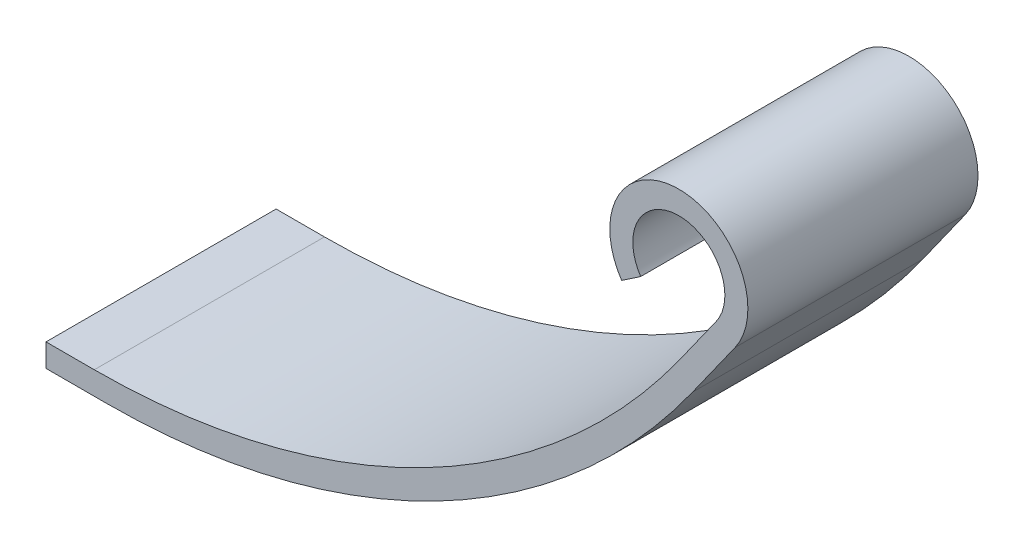
ISO-10303-21;
HEADER;
FILE_DESCRIPTION(('STEP AP214'),'2;1');
FILE_NAME('part.step','',(''),(''),'','','');
FILE_SCHEMA(('AUTOMOTIVE_DESIGN { 1 0 10303 214 1 1 1 1 }'));
ENDSEC;
DATA;
#1=APPLICATION_CONTEXT('core data for automotive mechanical design processes');
#2=APPLICATION_PROTOCOL_DEFINITION('international standard','automotive_design',2000,#1);
#3=PRODUCT_CONTEXT('',#1,'mechanical');
#4=PRODUCT('Part','Part','',(#3));
#5=PRODUCT_RELATED_PRODUCT_CATEGORY('part','',(#4));
#6=PRODUCT_DEFINITION_FORMATION('','',#4);
#7=PRODUCT_DEFINITION_CONTEXT('part definition',#1,'design');
#8=PRODUCT_DEFINITION('design','',#6,#7);
#9=PRODUCT_DEFINITION_SHAPE('','',#8);
#10=(LENGTH_UNIT() NAMED_UNIT(*) SI_UNIT(.MILLI.,.METRE.));
#11=(NAMED_UNIT(*) PLANE_ANGLE_UNIT() SI_UNIT($,.RADIAN.));
#12=(NAMED_UNIT(*) SI_UNIT($,.STERADIAN.) SOLID_ANGLE_UNIT());
#13=UNCERTAINTY_MEASURE_WITH_UNIT(LENGTH_MEASURE(1.E-05),#10,'distance_accuracy_value','');
#14=(GEOMETRIC_REPRESENTATION_CONTEXT(3) GLOBAL_UNCERTAINTY_ASSIGNED_CONTEXT((#13)) GLOBAL_UNIT_ASSIGNED_CONTEXT((#10,
#11,#12)) REPRESENTATION_CONTEXT('',''));
#15=CARTESIAN_POINT('',(0.,0.,0.));
#16=DIRECTION('',(0.,0.,1.));
#17=DIRECTION('',(1.,0.,0.));
#18=AXIS2_PLACEMENT_3D('',#15,#16,#17);
#19=CARTESIAN_POINT('',(0.,0.,8.));
#20=DIRECTION('',(1.,0.,0.));
#21=DIRECTION('',(0.,0.,-1.));
#22=AXIS2_PLACEMENT_3D('',#19,#20,#21);
#23=PLANE('',#22);
#24=DIRECTION('',(0.,-1.,0.));
#25=VECTOR('',#24,1.);
#26=CARTESIAN_POINT('',(0.,0.,0.));
#27=LINE('',#26,#25);
#28=CARTESIAN_POINT('',(0.,0.8,0.));
#29=VERTEX_POINT('',#28);
#30=CARTESIAN_POINT('',(0.,0.,0.));
#31=VERTEX_POINT('',#30);
#32=EDGE_CURVE('E135',#29,#31,#27,.T.);
#33=ORIENTED_EDGE('',*,*,#32,.T.);
#34=DIRECTION('',(0.,0.,-1.));
#35=VECTOR('',#34,1.);
#36=CARTESIAN_POINT('',(0.,0.,8.));
#37=LINE('',#36,#35);
#38=CARTESIAN_POINT('',(0.,0.,8.));
#39=VERTEX_POINT('',#38);
#40=EDGE_CURVE('E116',#39,#31,#37,.T.);
#41=ORIENTED_EDGE('',*,*,#40,.F.);
#42=DIRECTION('',(0.,-1.,0.));
#43=VECTOR('',#42,1.);
#44=CARTESIAN_POINT('',(0.,0.,8.));
#45=LINE('',#44,#43);
#46=CARTESIAN_POINT('',(0.,0.8,8.));
#47=VERTEX_POINT('',#46);
#48=EDGE_CURVE('E123',#47,#39,#45,.T.);
#49=ORIENTED_EDGE('',*,*,#48,.F.);
#50=DIRECTION('',(0.,0.,-1.));
#51=VECTOR('',#50,1.);
#52=CARTESIAN_POINT('',(0.,0.8,8.));
#53=LINE('',#52,#51);
#54=EDGE_CURVE('E178',#47,#29,#53,.T.);
#55=ORIENTED_EDGE('',*,*,#54,.T.);
#56=EDGE_LOOP('',(#33,#41,#49,#55));
#57=FACE_BOUND('',#56,.T.);
#58=ADVANCED_FACE('F33',(#57),#23,.F.);
#59=CARTESIAN_POINT('',(0.,0.,8.));
#60=DIRECTION('',(0.,1.,0.));
#61=DIRECTION('',(0.,0.,1.));
#62=AXIS2_PLACEMENT_3D('',#59,#60,#61);
#63=PLANE('',#62);
#64=DIRECTION('',(1.,0.,0.));
#65=VECTOR('',#64,1.);
#66=CARTESIAN_POINT('',(0.,0.,0.));
#67=LINE('',#66,#65);
#68=CARTESIAN_POINT('',(2.09240085245693,0.,0.));
#69=VERTEX_POINT('',#68);
#70=EDGE_CURVE('E155',#31,#69,#67,.T.);
#71=ORIENTED_EDGE('',*,*,#70,.T.);
#72=DIRECTION('',(0.,0.,-1.));
#73=VECTOR('',#72,1.);
#74=CARTESIAN_POINT('',(2.09240085245693,0.,8.));
#75=LINE('',#74,#73);
#76=CARTESIAN_POINT('',(2.09240085245693,0.,8.));
#77=VERTEX_POINT('',#76);
#78=EDGE_CURVE('E119',#69,#77,#75,.F.);
#79=ORIENTED_EDGE('',*,*,#78,.T.);
#80=DIRECTION('',(1.,0.,0.));
#81=VECTOR('',#80,1.);
#82=CARTESIAN_POINT('',(0.,0.,8.));
#83=LINE('',#82,#81);
#84=EDGE_CURVE('E111',#39,#77,#83,.T.);
#85=ORIENTED_EDGE('',*,*,#84,.F.);
#86=ORIENTED_EDGE('',*,*,#40,.T.);
#87=EDGE_LOOP('',(#71,#79,#85,#86));
#88=FACE_BOUND('',#87,.T.);
#89=ADVANCED_FACE('F114',(#88),#63,.F.);
#90=CARTESIAN_POINT('',(15.,0.,8.));
#91=DIRECTION('',(-0.8152791451879,0.579068144022521,0.));
#92=DIRECTION('',(-0.579068144022521,-0.8152791451879,0.));
#93=AXIS2_PLACEMENT_3D('',#90,#91,#92);
#94=PLANE('',#93);
#95=DIRECTION('',(0.579068144022521,0.8152791451879,0.));
#96=VECTOR('',#95,1.);
#97=CARTESIAN_POINT('',(15.,0.,8.));
#98=LINE('',#97,#96);
#99=CARTESIAN_POINT('',(22.4743794821544,10.523296399437,8.));
#100=VERTEX_POINT('',#99);
#101=CARTESIAN_POINT('',(23.956669948451,12.610236454346,8.));
#102=VERTEX_POINT('',#101);
#103=EDGE_CURVE('E122',#100,#102,#98,.T.);
#104=ORIENTED_EDGE('',*,*,#103,.F.);
#105=DIRECTION('',(0.,0.,-1.));
#106=VECTOR('',#105,1.);
#107=CARTESIAN_POINT('',(22.4743794821544,10.523296399437,8.));
#108=LINE('',#107,#106);
#109=CARTESIAN_POINT('',(22.4743794821544,10.523296399437,0.));
#110=VERTEX_POINT('',#109);
#111=EDGE_CURVE('E136',#100,#110,#108,.T.);
#112=ORIENTED_EDGE('',*,*,#111,.T.);
#113=DIRECTION('',(0.579068144022521,0.8152791451879,0.));
#114=VECTOR('',#113,1.);
#115=CARTESIAN_POINT('',(15.,0.,0.));
#116=LINE('',#115,#114);
#117=CARTESIAN_POINT('',(23.956669948451,12.610236454346,0.));
#118=VERTEX_POINT('',#117);
#119=EDGE_CURVE('E157',#110,#118,#116,.T.);
#120=ORIENTED_EDGE('',*,*,#119,.T.);
#121=DIRECTION('',(0.,0.,-1.));
#122=VECTOR('',#121,1.);
#123=CARTESIAN_POINT('',(23.956669948451,12.610236454346,8.));
#124=LINE('',#123,#122);
#125=EDGE_CURVE('E137',#102,#118,#124,.T.);
#126=ORIENTED_EDGE('',*,*,#125,.F.);
#127=EDGE_LOOP('',(#104,#112,#120,#126));
#128=FACE_BOUND('',#127,.T.);
#129=ADVANCED_FACE('F165',(#128),#94,.F.);
#130=CARTESIAN_POINT('',(22.,14.,8.));
#131=DIRECTION('',(0.,0.,-1.));
#132=DIRECTION('',(-1.,0.,0.));
#133=AXIS2_PLACEMENT_3D('',#130,#131,#132);
#134=CYLINDRICAL_SURFACE('',#133,2.4);
#135=CARTESIAN_POINT('',(22.,14.,0.));
#136=DIRECTION('',(0.,0.,1.));
#137=DIRECTION('',(1.,0.,0.));
#138=AXIS2_PLACEMENT_3D('',#135,#136,#137);
#139=CIRCLE('',#138,2.4);
#140=CARTESIAN_POINT('',(20.0118829343515,12.6556077457538,0.));
#141=VERTEX_POINT('',#140);
#142=EDGE_CURVE('E181',#118,#141,#139,.T.);
#143=ORIENTED_EDGE('',*,*,#142,.T.);
#144=DIRECTION('',(0.,0.,-1.));
#145=VECTOR('',#144,1.);
#146=CARTESIAN_POINT('',(20.0118829343515,12.6556077457538,8.));
#147=LINE('',#146,#145);
#148=CARTESIAN_POINT('',(20.0118829343515,12.6556077457538,8.));
#149=VERTEX_POINT('',#148);
#150=EDGE_CURVE('E142',#149,#141,#147,.T.);
#151=ORIENTED_EDGE('',*,*,#150,.F.);
#152=CARTESIAN_POINT('',(22.,14.,8.));
#153=DIRECTION('',(0.,0.,1.));
#154=DIRECTION('',(1.,0.,0.));
#155=AXIS2_PLACEMENT_3D('',#152,#153,#154);
#156=CIRCLE('',#155,2.4);
#157=EDGE_CURVE('E167',#102,#149,#156,.T.);
#158=ORIENTED_EDGE('',*,*,#157,.F.);
#159=ORIENTED_EDGE('',*,*,#125,.T.);
#160=EDGE_LOOP('',(#143,#151,#158,#159));
#161=FACE_BOUND('',#160,.T.);
#162=ADVANCED_FACE('F263',(#161),#134,.T.);
#163=CARTESIAN_POINT('',(20.674588622901,13.1037384971692,8.));
#164=DIRECTION('',(-0.560163439269271,0.828382110686863,0.));
#165=DIRECTION('',(-0.828382110686863,-0.560163439269271,0.));
#166=AXIS2_PLACEMENT_3D('',#163,#164,#165);
#167=PLANE('',#166);
#168=DIRECTION('',(0.828382110686863,0.560163439269271,0.));
#169=VECTOR('',#168,1.);
#170=CARTESIAN_POINT('',(20.674588622901,13.1037384971692,0.));
#171=LINE('',#170,#169);
#172=CARTESIAN_POINT('',(20.674588622901,13.1037384971692,0.));
#173=VERTEX_POINT('',#172);
#174=EDGE_CURVE('E183',#141,#173,#171,.T.);
#175=ORIENTED_EDGE('',*,*,#174,.T.);
#176=DIRECTION('',(0.,0.,-1.));
#177=VECTOR('',#176,1.);
#178=CARTESIAN_POINT('',(20.674588622901,13.1037384971692,8.));
#179=LINE('',#178,#177);
#180=CARTESIAN_POINT('',(20.674588622901,13.1037384971692,8.));
#181=VERTEX_POINT('',#180);
#182=EDGE_CURVE('E194',#181,#173,#179,.T.);
#183=ORIENTED_EDGE('',*,*,#182,.F.);
#184=DIRECTION('',(0.828382110686863,0.560163439269271,0.));
#185=VECTOR('',#184,1.);
#186=CARTESIAN_POINT('',(20.674588622901,13.1037384971692,8.));
#187=LINE('',#186,#185);
#188=EDGE_CURVE('E169',#149,#181,#187,.T.);
#189=ORIENTED_EDGE('',*,*,#188,.F.);
#190=ORIENTED_EDGE('',*,*,#150,.T.);
#191=EDGE_LOOP('',(#175,#183,#189,#190));
#192=FACE_BOUND('',#191,.T.);
#193=ADVANCED_FACE('F201',(#192),#167,.F.);
#194=CARTESIAN_POINT('',(22.,14.,8.));
#195=DIRECTION('',(0.,0.,-1.));
#196=DIRECTION('',(-1.,0.,0.));
#197=AXIS2_PLACEMENT_3D('',#194,#195,#196);
#198=CYLINDRICAL_SURFACE('',#197,1.6);
#199=CARTESIAN_POINT('',(22.,14.,0.));
#200=DIRECTION('',(0.,0.,-1.));
#201=DIRECTION('',(1.,0.,0.));
#202=AXIS2_PLACEMENT_3D('',#199,#200,#201);
#203=CIRCLE('',#202,1.6);
#204=CARTESIAN_POINT('',(23.3044466323006,13.073490969564,0.));
#205=VERTEX_POINT('',#204);
#206=EDGE_CURVE('E185',#173,#205,#203,.T.);
#207=ORIENTED_EDGE('',*,*,#206,.T.);
#208=DIRECTION('',(0.,0.,-1.));
#209=VECTOR('',#208,1.);
#210=CARTESIAN_POINT('',(23.3044466323006,13.073490969564,8.));
#211=LINE('',#210,#209);
#212=CARTESIAN_POINT('',(23.3044466323006,13.073490969564,8.));
#213=VERTEX_POINT('',#212);
#214=EDGE_CURVE('E191',#213,#205,#211,.T.);
#215=ORIENTED_EDGE('',*,*,#214,.F.);
#216=CARTESIAN_POINT('',(22.,14.,8.));
#217=DIRECTION('',(0.,0.,-1.));
#218=DIRECTION('',(1.,0.,0.));
#219=AXIS2_PLACEMENT_3D('',#216,#217,#218);
#220=CIRCLE('',#219,1.6);
#221=EDGE_CURVE('E173',#181,#213,#220,.T.);
#222=ORIENTED_EDGE('',*,*,#221,.F.);
#223=ORIENTED_EDGE('',*,*,#182,.T.);
#224=EDGE_LOOP('',(#207,#215,#222,#223));
#225=FACE_BOUND('',#224,.T.);
#226=ADVANCED_FACE('F207',(#225),#198,.F.);
#227=CARTESIAN_POINT('',(14.5869568272786,0.8,8.));
#228=DIRECTION('',(0.8152791451879,-0.579068144022521,0.));
#229=DIRECTION('',(0.579068144022521,0.8152791451879,0.));
#230=AXIS2_PLACEMENT_3D('',#227,#228,#229);
#231=PLANE('',#230);
#232=DIRECTION('',(-0.579068144022521,-0.8152791451879,0.));
#233=VECTOR('',#232,1.);
#234=CARTESIAN_POINT('',(14.5869568272786,0.8,0.));
#235=LINE('',#234,#233);
#236=CARTESIAN_POINT('',(22.0613363094331,11.323296399437,0.));
#237=VERTEX_POINT('',#236);
#238=EDGE_CURVE('E187',#205,#237,#235,.T.);
#239=ORIENTED_EDGE('',*,*,#238,.T.);
#240=DIRECTION('',(0.,0.,-1.));
#241=VECTOR('',#240,1.);
#242=CARTESIAN_POINT('',(22.0613363094331,11.323296399437,8.));
#243=LINE('',#242,#241);
#244=CARTESIAN_POINT('',(22.0613363094331,11.323296399437,8.));
#245=VERTEX_POINT('',#244);
#246=EDGE_CURVE('E48',#237,#245,#243,.F.);
#247=ORIENTED_EDGE('',*,*,#246,.T.);
#248=DIRECTION('',(-0.579068144022521,-0.8152791451879,0.));
#249=VECTOR('',#248,1.);
#250=CARTESIAN_POINT('',(14.5869568272786,0.8,8.));
#251=LINE('',#250,#249);
#252=EDGE_CURVE('E175',#213,#245,#251,.T.);
#253=ORIENTED_EDGE('',*,*,#252,.F.);
#254=ORIENTED_EDGE('',*,*,#214,.T.);
#255=EDGE_LOOP('',(#239,#247,#253,#254));
#256=FACE_BOUND('',#255,.T.);
#257=ADVANCED_FACE('F209',(#256),#231,.F.);
#258=CARTESIAN_POINT('',(0.,0.8,8.));
#259=DIRECTION('',(0.,-1.,0.));
#260=DIRECTION('',(1.,0.,0.));
#261=AXIS2_PLACEMENT_3D('',#258,#259,#260);
#262=PLANE('',#261);
#263=DIRECTION('',(-1.,0.,0.));
#264=VECTOR('',#263,1.);
#265=CARTESIAN_POINT('',(0.,0.8,8.));
#266=LINE('',#265,#264);
#267=CARTESIAN_POINT('',(1.67935767973556,0.8,8.));
#268=VERTEX_POINT('',#267);
#269=EDGE_CURVE('E128',#268,#47,#266,.T.);
#270=ORIENTED_EDGE('',*,*,#269,.F.);
#271=DIRECTION('',(0.,0.,-1.));
#272=VECTOR('',#271,1.);
#273=CARTESIAN_POINT('',(1.67935767973556,0.8,0.));
#274=LINE('',#273,#272);
#275=CARTESIAN_POINT('',(1.67935767973556,0.8,0.));
#276=VERTEX_POINT('',#275);
#277=EDGE_CURVE('E147',#268,#276,#274,.T.);
#278=ORIENTED_EDGE('',*,*,#277,.T.);
#279=DIRECTION('',(-1.,0.,0.));
#280=VECTOR('',#279,1.);
#281=CARTESIAN_POINT('',(0.,0.8,0.));
#282=LINE('',#281,#280);
#283=EDGE_CURVE('E132',#276,#29,#282,.T.);
#284=ORIENTED_EDGE('',*,*,#283,.T.);
#285=ORIENTED_EDGE('',*,*,#54,.F.);
#286=EDGE_LOOP('',(#270,#278,#284,#285));
#287=FACE_BOUND('',#286,.T.);
#288=ADVANCED_FACE('F214',(#287),#262,.F.);
#289=CARTESIAN_POINT('',(22.,14.,8.));
#290=DIRECTION('',(0.,0.,1.));
#291=DIRECTION('',(1.,0.,0.));
#292=AXIS2_PLACEMENT_3D('',#289,#290,#291);
#293=PLANE('',#292);
#294=ORIENTED_EDGE('',*,*,#84,.T.);
#295=CARTESIAN_POINT('',(2.09240085245693,25.,8.));
#296=DIRECTION('',(0.,0.,1.));
#297=DIRECTION('',(1.,0.,0.));
#298=AXIS2_PLACEMENT_3D('',#295,#296,#297);
#299=CIRCLE('',#298,25.);
#300=EDGE_CURVE('E11',#77,#100,#299,.T.);
#301=ORIENTED_EDGE('',*,*,#300,.T.);
#302=ORIENTED_EDGE('',*,*,#103,.T.);
#303=ORIENTED_EDGE('',*,*,#157,.T.);
#304=ORIENTED_EDGE('',*,*,#188,.T.);
#305=ORIENTED_EDGE('',*,*,#221,.T.);
#306=ORIENTED_EDGE('',*,*,#252,.T.);
#307=CARTESIAN_POINT('',(1.67935767973556,25.8,8.));
#308=DIRECTION('',(0.,0.,1.));
#309=DIRECTION('',(1.,0.,0.));
#310=AXIS2_PLACEMENT_3D('',#307,#308,#309);
#311=CIRCLE('',#310,25.);
#312=EDGE_CURVE('E152',#245,#268,#311,.F.);
#313=ORIENTED_EDGE('',*,*,#312,.T.);
#314=ORIENTED_EDGE('',*,*,#269,.T.);
#315=ORIENTED_EDGE('',*,*,#48,.T.);
#316=EDGE_LOOP('',(#294,#301,#302,#303,#304,#305,#306,#313,#314,#315));
#317=FACE_BOUND('',#316,.T.);
#318=ADVANCED_FACE('F126',(#317),#293,.T.);
#319=CARTESIAN_POINT('',(22.,14.,0.));
#320=DIRECTION('',(0.,0.,1.));
#321=DIRECTION('',(1.,0.,0.));
#322=AXIS2_PLACEMENT_3D('',#319,#320,#321);
#323=PLANE('',#322);
#324=ORIENTED_EDGE('',*,*,#119,.F.);
#325=CARTESIAN_POINT('',(2.09240085245693,25.,0.));
#326=DIRECTION('',(0.,0.,1.));
#327=DIRECTION('',(1.,0.,0.));
#328=AXIS2_PLACEMENT_3D('',#325,#326,#327);
#329=CIRCLE('',#328,25.);
#330=EDGE_CURVE('E41',#110,#69,#329,.F.);
#331=ORIENTED_EDGE('',*,*,#330,.T.);
#332=ORIENTED_EDGE('',*,*,#70,.F.);
#333=ORIENTED_EDGE('',*,*,#32,.F.);
#334=ORIENTED_EDGE('',*,*,#283,.F.);
#335=CARTESIAN_POINT('',(1.67935767973556,25.8,0.));
#336=DIRECTION('',(0.,0.,1.));
#337=DIRECTION('',(1.,0.,0.));
#338=AXIS2_PLACEMENT_3D('',#335,#336,#337);
#339=CIRCLE('',#338,25.);
#340=EDGE_CURVE('E56',#276,#237,#339,.T.);
#341=ORIENTED_EDGE('',*,*,#340,.T.);
#342=ORIENTED_EDGE('',*,*,#238,.F.);
#343=ORIENTED_EDGE('',*,*,#206,.F.);
#344=ORIENTED_EDGE('',*,*,#174,.F.);
#345=ORIENTED_EDGE('',*,*,#142,.F.);
#346=EDGE_LOOP('',(#324,#331,#332,#333,#334,#341,#342,#343,#344,#345));
#347=FACE_BOUND('',#346,.T.);
#348=ADVANCED_FACE('F154',(#347),#323,.F.);
#349=CARTESIAN_POINT('',(2.09240085245693,25.,8.));
#350=DIRECTION('',(0.,0.,-1.));
#351=DIRECTION('',(-1.,0.,0.));
#352=AXIS2_PLACEMENT_3D('',#349,#350,#351);
#353=CYLINDRICAL_SURFACE('',#352,25.);
#354=ORIENTED_EDGE('',*,*,#300,.F.);
#355=ORIENTED_EDGE('',*,*,#78,.F.);
#356=ORIENTED_EDGE('',*,*,#330,.F.);
#357=ORIENTED_EDGE('',*,*,#111,.F.);
#358=EDGE_LOOP('',(#354,#355,#356,#357));
#359=FACE_BOUND('',#358,.T.);
#360=ADVANCED_FACE('F161',(#359),#353,.T.);
#361=CARTESIAN_POINT('',(1.67935767973556,25.8,8.));
#362=DIRECTION('',(0.,0.,1.));
#363=DIRECTION('',(1.,0.,0.));
#364=AXIS2_PLACEMENT_3D('',#361,#362,#363);
#365=CYLINDRICAL_SURFACE('',#364,25.);
#366=ORIENTED_EDGE('',*,*,#312,.F.);
#367=ORIENTED_EDGE('',*,*,#246,.F.);
#368=ORIENTED_EDGE('',*,*,#340,.F.);
#369=ORIENTED_EDGE('',*,*,#277,.F.);
#370=EDGE_LOOP('',(#366,#367,#368,#369));
#371=FACE_BOUND('',#370,.T.);
#372=ADVANCED_FACE('F35',(#371),#365,.F.);
#373=CLOSED_SHELL('',(#58,#89,#129,#162,#193,#226,#257,#288,#318,#348,#360,#372));
#374=MANIFOLD_SOLID_BREP('B2',#373);
#375=ADVANCED_BREP_SHAPE_REPRESENTATION('',(#18,#374),#14);
#376=SHAPE_DEFINITION_REPRESENTATION(#9,#375);
ENDSEC;
END-ISO-10303-21;
